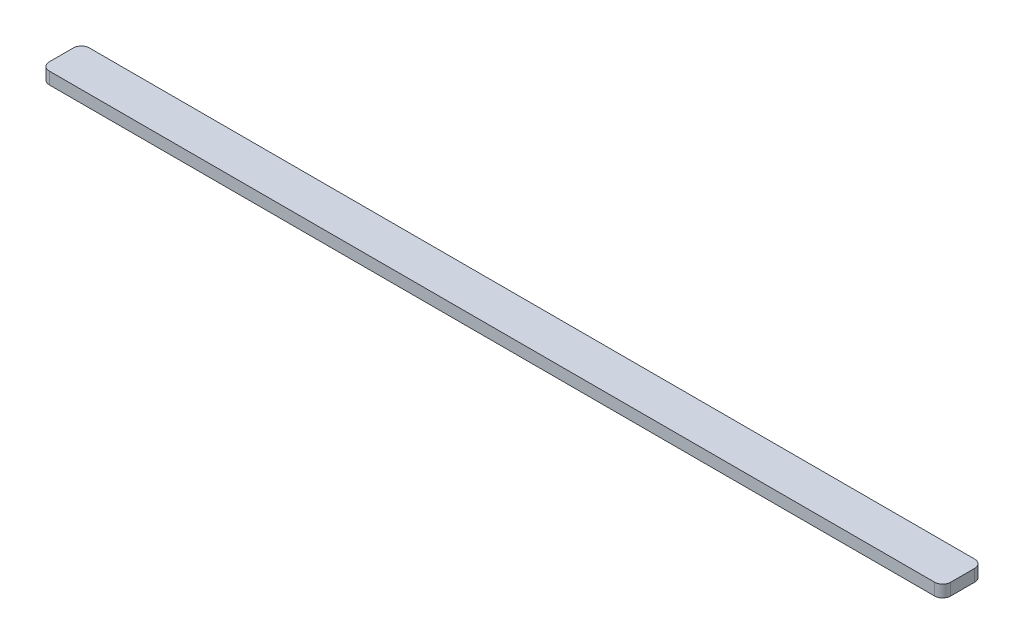
ISO-10303-21;
HEADER;
FILE_DESCRIPTION(('STEP AP214'),'2;1');
FILE_NAME('part.step','',(''),(''),'','','');
FILE_SCHEMA(('AUTOMOTIVE_DESIGN { 1 0 10303 214 1 1 1 1 }'));
ENDSEC;
DATA;
#1=APPLICATION_CONTEXT('core data for automotive mechanical design processes');
#2=APPLICATION_PROTOCOL_DEFINITION('international standard','automotive_design',2000,#1);
#3=PRODUCT_CONTEXT('',#1,'mechanical');
#4=PRODUCT('Part','Part','',(#3));
#5=PRODUCT_RELATED_PRODUCT_CATEGORY('part','',(#4));
#6=PRODUCT_DEFINITION_FORMATION('','',#4);
#7=PRODUCT_DEFINITION_CONTEXT('part definition',#1,'design');
#8=PRODUCT_DEFINITION('design','',#6,#7);
#9=PRODUCT_DEFINITION_SHAPE('','',#8);
#10=(LENGTH_UNIT() NAMED_UNIT(*) SI_UNIT(.MILLI.,.METRE.));
#11=(NAMED_UNIT(*) PLANE_ANGLE_UNIT() SI_UNIT($,.RADIAN.));
#12=(NAMED_UNIT(*) SI_UNIT($,.STERADIAN.) SOLID_ANGLE_UNIT());
#13=UNCERTAINTY_MEASURE_WITH_UNIT(LENGTH_MEASURE(1.E-05),#10,'distance_accuracy_value','');
#14=(GEOMETRIC_REPRESENTATION_CONTEXT(3) GLOBAL_UNCERTAINTY_ASSIGNED_CONTEXT((#13)) GLOBAL_UNIT_ASSIGNED_CONTEXT((#10,
#11,#12)) REPRESENTATION_CONTEXT('',''));
#15=CARTESIAN_POINT('',(0.,0.,0.));
#16=DIRECTION('',(0.,0.,1.));
#17=DIRECTION('',(1.,0.,0.));
#18=AXIS2_PLACEMENT_3D('',#15,#16,#17);
#19=CARTESIAN_POINT('',(0.,3.,0.));
#20=DIRECTION('',(1.,0.,0.));
#21=DIRECTION('',(0.,0.,-1.));
#22=AXIS2_PLACEMENT_3D('',#19,#20,#21);
#23=PLANE('',#22);
#24=DIRECTION('',(0.,0.,1.));
#25=VECTOR('',#24,1.);
#26=CARTESIAN_POINT('',(0.,0.,0.));
#27=LINE('',#26,#25);
#28=CARTESIAN_POINT('',(0.,0.,-8.));
#29=VERTEX_POINT('',#28);
#30=CARTESIAN_POINT('',(0.,0.,-2.));
#31=VERTEX_POINT('',#30);
#32=EDGE_CURVE('E128',#29,#31,#27,.T.);
#33=ORIENTED_EDGE('',*,*,#32,.T.);
#34=DIRECTION('',(0.,-1.,0.));
#35=VECTOR('',#34,1.);
#36=CARTESIAN_POINT('',(0.,3.,-2.));
#37=LINE('',#36,#35);
#38=CARTESIAN_POINT('',(0.,3.,-2.));
#39=VERTEX_POINT('',#38);
#40=EDGE_CURVE('E106',#31,#39,#37,.F.);
#41=ORIENTED_EDGE('',*,*,#40,.T.);
#42=DIRECTION('',(0.,0.,1.));
#43=VECTOR('',#42,1.);
#44=CARTESIAN_POINT('',(0.,3.,0.));
#45=LINE('',#44,#43);
#46=CARTESIAN_POINT('',(0.,3.,-8.));
#47=VERTEX_POINT('',#46);
#48=EDGE_CURVE('E137',#47,#39,#45,.T.);
#49=ORIENTED_EDGE('',*,*,#48,.F.);
#50=DIRECTION('',(0.,-1.,0.));
#51=VECTOR('',#50,1.);
#52=CARTESIAN_POINT('',(0.,3.,-8.));
#53=LINE('',#52,#51);
#54=EDGE_CURVE('E111',#47,#29,#53,.T.);
#55=ORIENTED_EDGE('',*,*,#54,.T.);
#56=EDGE_LOOP('',(#33,#41,#49,#55));
#57=FACE_BOUND('',#56,.T.);
#58=ADVANCED_FACE('F35',(#57),#23,.F.);
#59=CARTESIAN_POINT('',(0.,3.,0.));
#60=DIRECTION('',(0.,0.,-1.));
#61=DIRECTION('',(-1.,0.,0.));
#62=AXIS2_PLACEMENT_3D('',#59,#60,#61);
#63=PLANE('',#62);
#64=DIRECTION('',(1.,0.,0.));
#65=VECTOR('',#64,1.);
#66=CARTESIAN_POINT('',(0.,3.,0.));
#67=LINE('',#66,#65);
#68=CARTESIAN_POINT('',(2.,3.,0.));
#69=VERTEX_POINT('',#68);
#70=CARTESIAN_POINT('',(223.,3.,0.));
#71=VERTEX_POINT('',#70);
#72=EDGE_CURVE('E121',#69,#71,#67,.T.);
#73=ORIENTED_EDGE('',*,*,#72,.F.);
#74=DIRECTION('',(0.,-1.,0.));
#75=VECTOR('',#74,1.);
#76=CARTESIAN_POINT('',(2.,3.,0.));
#77=LINE('',#76,#75);
#78=CARTESIAN_POINT('',(2.,0.,0.));
#79=VERTEX_POINT('',#78);
#80=EDGE_CURVE('E105',#69,#79,#77,.T.);
#81=ORIENTED_EDGE('',*,*,#80,.T.);
#82=DIRECTION('',(1.,0.,0.));
#83=VECTOR('',#82,1.);
#84=CARTESIAN_POINT('',(0.,0.,0.));
#85=LINE('',#84,#83);
#86=CARTESIAN_POINT('',(223.,0.,0.));
#87=VERTEX_POINT('',#86);
#88=EDGE_CURVE('E118',#79,#87,#85,.T.);
#89=ORIENTED_EDGE('',*,*,#88,.T.);
#90=DIRECTION('',(0.,-1.,0.));
#91=VECTOR('',#90,1.);
#92=CARTESIAN_POINT('',(223.,3.,0.));
#93=LINE('',#92,#91);
#94=EDGE_CURVE('E123',#87,#71,#93,.F.);
#95=ORIENTED_EDGE('',*,*,#94,.T.);
#96=EDGE_LOOP('',(#73,#81,#89,#95));
#97=FACE_BOUND('',#96,.T.);
#98=ADVANCED_FACE('F117',(#97),#63,.F.);
#99=CARTESIAN_POINT('',(225.,3.,0.));
#100=DIRECTION('',(-1.,0.,0.));
#101=DIRECTION('',(0.,0.,1.));
#102=AXIS2_PLACEMENT_3D('',#99,#100,#101);
#103=PLANE('',#102);
#104=DIRECTION('',(0.,0.,-1.));
#105=VECTOR('',#104,1.);
#106=CARTESIAN_POINT('',(225.,0.,0.));
#107=LINE('',#106,#105);
#108=CARTESIAN_POINT('',(225.,0.,-2.));
#109=VERTEX_POINT('',#108);
#110=CARTESIAN_POINT('',(225.,0.,-8.));
#111=VERTEX_POINT('',#110);
#112=EDGE_CURVE('E127',#109,#111,#107,.T.);
#113=ORIENTED_EDGE('',*,*,#112,.T.);
#114=DIRECTION('',(0.,-1.,0.));
#115=VECTOR('',#114,1.);
#116=CARTESIAN_POINT('',(225.,3.,-8.));
#117=LINE('',#116,#115);
#118=CARTESIAN_POINT('',(225.,3.,-8.));
#119=VERTEX_POINT('',#118);
#120=EDGE_CURVE('E11',#111,#119,#117,.F.);
#121=ORIENTED_EDGE('',*,*,#120,.T.);
#122=DIRECTION('',(0.,0.,-1.));
#123=VECTOR('',#122,1.);
#124=CARTESIAN_POINT('',(225.,3.,0.));
#125=LINE('',#124,#123);
#126=CARTESIAN_POINT('',(225.,3.,-2.));
#127=VERTEX_POINT('',#126);
#128=EDGE_CURVE('E163',#127,#119,#125,.T.);
#129=ORIENTED_EDGE('',*,*,#128,.F.);
#130=DIRECTION('',(0.,-1.,0.));
#131=VECTOR('',#130,1.);
#132=CARTESIAN_POINT('',(225.,3.,-2.));
#133=LINE('',#132,#131);
#134=EDGE_CURVE('E43',#127,#109,#133,.T.);
#135=ORIENTED_EDGE('',*,*,#134,.T.);
#136=EDGE_LOOP('',(#113,#121,#129,#135));
#137=FACE_BOUND('',#136,.T.);
#138=ADVANCED_FACE('F161',(#137),#103,.F.);
#139=CARTESIAN_POINT('',(0.,3.,-10.));
#140=DIRECTION('',(0.,0.,1.));
#141=DIRECTION('',(1.,0.,0.));
#142=AXIS2_PLACEMENT_3D('',#139,#140,#141);
#143=PLANE('',#142);
#144=DIRECTION('',(-1.,0.,0.));
#145=VECTOR('',#144,1.);
#146=CARTESIAN_POINT('',(0.,0.,-10.));
#147=LINE('',#146,#145);
#148=CARTESIAN_POINT('',(223.,0.,-10.));
#149=VERTEX_POINT('',#148);
#150=CARTESIAN_POINT('',(2.,0.,-10.));
#151=VERTEX_POINT('',#150);
#152=EDGE_CURVE('E131',#149,#151,#147,.T.);
#153=ORIENTED_EDGE('',*,*,#152,.T.);
#154=DIRECTION('',(0.,-1.,0.));
#155=VECTOR('',#154,1.);
#156=CARTESIAN_POINT('',(2.,3.,-10.));
#157=LINE('',#156,#155);
#158=CARTESIAN_POINT('',(2.,3.,-10.));
#159=VERTEX_POINT('',#158);
#160=EDGE_CURVE('E50',#151,#159,#157,.F.);
#161=ORIENTED_EDGE('',*,*,#160,.T.);
#162=DIRECTION('',(-1.,0.,0.));
#163=VECTOR('',#162,1.);
#164=CARTESIAN_POINT('',(0.,3.,-10.));
#165=LINE('',#164,#163);
#166=CARTESIAN_POINT('',(223.,3.,-10.));
#167=VERTEX_POINT('',#166);
#168=EDGE_CURVE('E138',#167,#159,#165,.T.);
#169=ORIENTED_EDGE('',*,*,#168,.F.);
#170=DIRECTION('',(0.,-1.,0.));
#171=VECTOR('',#170,1.);
#172=CARTESIAN_POINT('',(223.,3.,-10.));
#173=LINE('',#172,#171);
#174=EDGE_CURVE('E154',#167,#149,#173,.T.);
#175=ORIENTED_EDGE('',*,*,#174,.T.);
#176=EDGE_LOOP('',(#153,#161,#169,#175));
#177=FACE_BOUND('',#176,.T.);
#178=ADVANCED_FACE('F170',(#177),#143,.F.);
#179=CARTESIAN_POINT('',(0.,3.,0.));
#180=DIRECTION('',(0.,-1.,0.));
#181=DIRECTION('',(0.,0.,-1.));
#182=AXIS2_PLACEMENT_3D('',#179,#180,#181);
#183=PLANE('',#182);
#184=ORIENTED_EDGE('',*,*,#48,.T.);
#185=CARTESIAN_POINT('',(2.,3.,-2.));
#186=DIRECTION('',(0.,-1.,0.));
#187=DIRECTION('',(0.,0.,-1.));
#188=AXIS2_PLACEMENT_3D('',#185,#186,#187);
#189=CIRCLE('',#188,2.);
#190=EDGE_CURVE('E152',#39,#69,#189,.F.);
#191=ORIENTED_EDGE('',*,*,#190,.T.);
#192=ORIENTED_EDGE('',*,*,#72,.T.);
#193=CARTESIAN_POINT('',(223.,3.,-2.));
#194=DIRECTION('',(0.,-1.,0.));
#195=DIRECTION('',(0.,0.,-1.));
#196=AXIS2_PLACEMENT_3D('',#193,#194,#195);
#197=CIRCLE('',#196,2.);
#198=EDGE_CURVE('E147',#71,#127,#197,.F.);
#199=ORIENTED_EDGE('',*,*,#198,.T.);
#200=ORIENTED_EDGE('',*,*,#128,.T.);
#201=CARTESIAN_POINT('',(223.,3.,-8.));
#202=DIRECTION('',(0.,-1.,0.));
#203=DIRECTION('',(0.,0.,-1.));
#204=AXIS2_PLACEMENT_3D('',#201,#202,#203);
#205=CIRCLE('',#204,2.);
#206=EDGE_CURVE('E57',#119,#167,#205,.F.);
#207=ORIENTED_EDGE('',*,*,#206,.T.);
#208=ORIENTED_EDGE('',*,*,#168,.T.);
#209=CARTESIAN_POINT('',(2.,3.,-8.));
#210=DIRECTION('',(0.,-1.,0.));
#211=DIRECTION('',(0.,0.,-1.));
#212=AXIS2_PLACEMENT_3D('',#209,#210,#211);
#213=CIRCLE('',#212,2.);
#214=EDGE_CURVE('E150',#159,#47,#213,.F.);
#215=ORIENTED_EDGE('',*,*,#214,.T.);
#216=EDGE_LOOP('',(#184,#191,#192,#199,#200,#207,#208,#215));
#217=FACE_BOUND('',#216,.T.);
#218=ADVANCED_FACE('F177',(#217),#183,.F.);
#219=CARTESIAN_POINT('',(0.,0.,0.));
#220=DIRECTION('',(0.,-1.,0.));
#221=DIRECTION('',(0.,0.,-1.));
#222=AXIS2_PLACEMENT_3D('',#219,#220,#221);
#223=PLANE('',#222);
#224=ORIENTED_EDGE('',*,*,#88,.F.);
#225=CARTESIAN_POINT('',(2.,0.,-2.));
#226=DIRECTION('',(0.,-1.,0.));
#227=DIRECTION('',(0.,0.,-1.));
#228=AXIS2_PLACEMENT_3D('',#225,#226,#227);
#229=CIRCLE('',#228,2.);
#230=EDGE_CURVE('E101',#79,#31,#229,.T.);
#231=ORIENTED_EDGE('',*,*,#230,.T.);
#232=ORIENTED_EDGE('',*,*,#32,.F.);
#233=CARTESIAN_POINT('',(2.,0.,-8.));
#234=DIRECTION('',(0.,-1.,0.));
#235=DIRECTION('',(0.,0.,-1.));
#236=AXIS2_PLACEMENT_3D('',#233,#234,#235);
#237=CIRCLE('',#236,2.);
#238=EDGE_CURVE('E112',#29,#151,#237,.T.);
#239=ORIENTED_EDGE('',*,*,#238,.T.);
#240=ORIENTED_EDGE('',*,*,#152,.F.);
#241=CARTESIAN_POINT('',(223.,0.,-8.));
#242=DIRECTION('',(0.,-1.,0.));
#243=DIRECTION('',(0.,0.,-1.));
#244=AXIS2_PLACEMENT_3D('',#241,#242,#243);
#245=CIRCLE('',#244,2.);
#246=EDGE_CURVE('E141',#149,#111,#245,.T.);
#247=ORIENTED_EDGE('',*,*,#246,.T.);
#248=ORIENTED_EDGE('',*,*,#112,.F.);
#249=CARTESIAN_POINT('',(223.,0.,-2.));
#250=DIRECTION('',(0.,-1.,0.));
#251=DIRECTION('',(0.,0.,-1.));
#252=AXIS2_PLACEMENT_3D('',#249,#250,#251);
#253=CIRCLE('',#252,2.);
#254=EDGE_CURVE('E122',#109,#87,#253,.T.);
#255=ORIENTED_EDGE('',*,*,#254,.T.);
#256=EDGE_LOOP('',(#224,#231,#232,#239,#240,#247,#248,#255));
#257=FACE_BOUND('',#256,.T.);
#258=ADVANCED_FACE('F125',(#257),#223,.T.);
#259=CARTESIAN_POINT('',(2.,3.,-2.));
#260=DIRECTION('',(0.,-1.,0.));
#261=DIRECTION('',(0.,0.,-1.));
#262=AXIS2_PLACEMENT_3D('',#259,#260,#261);
#263=CYLINDRICAL_SURFACE('',#262,2.);
#264=ORIENTED_EDGE('',*,*,#190,.F.);
#265=ORIENTED_EDGE('',*,*,#40,.F.);
#266=ORIENTED_EDGE('',*,*,#230,.F.);
#267=ORIENTED_EDGE('',*,*,#80,.F.);
#268=EDGE_LOOP('',(#264,#265,#266,#267));
#269=FACE_BOUND('',#268,.T.);
#270=ADVANCED_FACE('F104',(#269),#263,.T.);
#271=CARTESIAN_POINT('',(2.,3.,-8.));
#272=DIRECTION('',(0.,-1.,0.));
#273=DIRECTION('',(0.,0.,-1.));
#274=AXIS2_PLACEMENT_3D('',#271,#272,#273);
#275=CYLINDRICAL_SURFACE('',#274,2.);
#276=ORIENTED_EDGE('',*,*,#214,.F.);
#277=ORIENTED_EDGE('',*,*,#160,.F.);
#278=ORIENTED_EDGE('',*,*,#238,.F.);
#279=ORIENTED_EDGE('',*,*,#54,.F.);
#280=EDGE_LOOP('',(#276,#277,#278,#279));
#281=FACE_BOUND('',#280,.T.);
#282=ADVANCED_FACE('F181',(#281),#275,.T.);
#283=CARTESIAN_POINT('',(223.,3.,-8.));
#284=DIRECTION('',(0.,-1.,0.));
#285=DIRECTION('',(0.,0.,-1.));
#286=AXIS2_PLACEMENT_3D('',#283,#284,#285);
#287=CYLINDRICAL_SURFACE('',#286,2.);
#288=ORIENTED_EDGE('',*,*,#206,.F.);
#289=ORIENTED_EDGE('',*,*,#120,.F.);
#290=ORIENTED_EDGE('',*,*,#246,.F.);
#291=ORIENTED_EDGE('',*,*,#174,.F.);
#292=EDGE_LOOP('',(#288,#289,#290,#291));
#293=FACE_BOUND('',#292,.T.);
#294=ADVANCED_FACE('F169',(#293),#287,.T.);
#295=CARTESIAN_POINT('',(223.,3.,-2.));
#296=DIRECTION('',(0.,-1.,0.));
#297=DIRECTION('',(0.,0.,-1.));
#298=AXIS2_PLACEMENT_3D('',#295,#296,#297);
#299=CYLINDRICAL_SURFACE('',#298,2.);
#300=ORIENTED_EDGE('',*,*,#198,.F.);
#301=ORIENTED_EDGE('',*,*,#94,.F.);
#302=ORIENTED_EDGE('',*,*,#254,.F.);
#303=ORIENTED_EDGE('',*,*,#134,.F.);
#304=EDGE_LOOP('',(#300,#301,#302,#303));
#305=FACE_BOUND('',#304,.T.);
#306=ADVANCED_FACE('F37',(#305),#299,.T.);
#307=CLOSED_SHELL('',(#58,#98,#138,#178,#218,#258,#270,#282,#294,#306));
#308=MANIFOLD_SOLID_BREP('B2',#307);
#309=ADVANCED_BREP_SHAPE_REPRESENTATION('',(#18,#308),#14);
#310=SHAPE_DEFINITION_REPRESENTATION(#9,#309);
ENDSEC;
END-ISO-10303-21;
